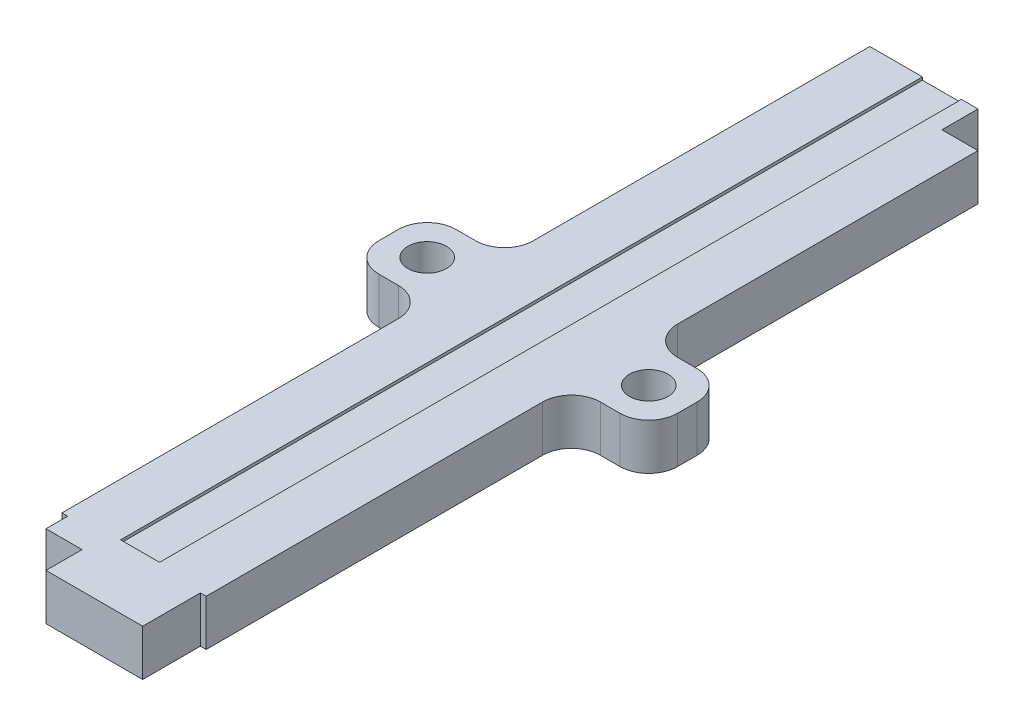
ISO-10303-21;
HEADER;
FILE_DESCRIPTION(('STEP AP214'),'2;1');
FILE_NAME('part.step','',(''),(''),'','','');
FILE_SCHEMA(('AUTOMOTIVE_DESIGN { 1 0 10303 214 1 1 1 1 }'));
ENDSEC;
DATA;
#1=APPLICATION_CONTEXT('core data for automotive mechanical design processes');
#2=APPLICATION_PROTOCOL_DEFINITION('international standard','automotive_design',2000,#1);
#3=PRODUCT_CONTEXT('',#1,'mechanical');
#4=PRODUCT('Part','Part','',(#3));
#5=PRODUCT_RELATED_PRODUCT_CATEGORY('part','',(#4));
#6=PRODUCT_DEFINITION_FORMATION('','',#4);
#7=PRODUCT_DEFINITION_CONTEXT('part definition',#1,'design');
#8=PRODUCT_DEFINITION('design','',#6,#7);
#9=PRODUCT_DEFINITION_SHAPE('','',#8);
#10=(LENGTH_UNIT() NAMED_UNIT(*) SI_UNIT(.MILLI.,.METRE.));
#11=(NAMED_UNIT(*) PLANE_ANGLE_UNIT() SI_UNIT($,.RADIAN.));
#12=(NAMED_UNIT(*) SI_UNIT($,.STERADIAN.) SOLID_ANGLE_UNIT());
#13=UNCERTAINTY_MEASURE_WITH_UNIT(LENGTH_MEASURE(1.E-05),#10,'distance_accuracy_value','');
#14=(GEOMETRIC_REPRESENTATION_CONTEXT(3) GLOBAL_UNCERTAINTY_ASSIGNED_CONTEXT((#13)) GLOBAL_UNIT_ASSIGNED_CONTEXT((#10,
#11,#12)) REPRESENTATION_CONTEXT('',''));
#15=CARTESIAN_POINT('',(0.,0.,0.));
#16=DIRECTION('',(0.,0.,1.));
#17=DIRECTION('',(1.,0.,0.));
#18=AXIS2_PLACEMENT_3D('',#15,#16,#17);
#19=CARTESIAN_POINT('',(-6.35,-2.032,228.6));
#20=DIRECTION('',(1.,0.,0.));
#21=DIRECTION('',(0.,0.,-1.));
#22=AXIS2_PLACEMENT_3D('',#19,#20,#21);
#23=PLANE('',#22);
#24=DIRECTION('',(0.,0.,-1.));
#25=VECTOR('',#24,1.);
#26=CARTESIAN_POINT('',(-6.35,2.032,228.6));
#27=LINE('',#26,#25);
#28=CARTESIAN_POINT('',(-6.34999999999999,2.032,223.52));
#29=VERTEX_POINT('',#28);
#30=CARTESIAN_POINT('',(-6.35,2.032,193.90106));
#31=VERTEX_POINT('',#30);
#32=EDGE_CURVE('E389',#29,#31,#27,.T.);
#33=ORIENTED_EDGE('',*,*,#32,.T.);
#34=DIRECTION('',(0.,1.,0.));
#35=VECTOR('',#34,1.);
#36=CARTESIAN_POINT('',(-6.35,-2.032,193.90106));
#37=LINE('',#36,#35);
#38=CARTESIAN_POINT('',(-6.35,-2.032,193.90106));
#39=VERTEX_POINT('',#38);
#40=EDGE_CURVE('E446',#31,#39,#37,.F.);
#41=ORIENTED_EDGE('',*,*,#40,.T.);
#42=DIRECTION('',(0.,0.,-1.));
#43=VECTOR('',#42,1.);
#44=CARTESIAN_POINT('',(-6.35,-2.032,228.6));
#45=LINE('',#44,#43);
#46=CARTESIAN_POINT('',(-6.34999999999999,-2.032,223.52));
#47=VERTEX_POINT('',#46);
#48=EDGE_CURVE('E254',#47,#39,#45,.T.);
#49=ORIENTED_EDGE('',*,*,#48,.F.);
#50=DIRECTION('',(0.,1.,0.));
#51=VECTOR('',#50,1.);
#52=CARTESIAN_POINT('',(-6.34999999999999,-2.032,223.52));
#53=LINE('',#52,#51);
#54=EDGE_CURVE('E331',#47,#29,#53,.T.);
#55=ORIENTED_EDGE('',*,*,#54,.T.);
#56=EDGE_LOOP('',(#33,#41,#49,#55));
#57=FACE_BOUND('',#56,.T.);
#58=ADVANCED_FACE('F35',(#57),#23,.F.);
#59=CARTESIAN_POINT('',(6.35,-2.032,228.6));
#60=DIRECTION('',(-1.,0.,0.));
#61=DIRECTION('',(0.,0.,1.));
#62=AXIS2_PLACEMENT_3D('',#59,#60,#61);
#63=PLANE('',#62);
#64=DIRECTION('',(0.,0.,-1.));
#65=VECTOR('',#64,1.);
#66=CARTESIAN_POINT('',(6.35,2.032,228.6));
#67=LINE('',#66,#65);
#68=CARTESIAN_POINT('',(6.35,2.032,182.01894));
#69=VERTEX_POINT('',#68);
#70=CARTESIAN_POINT('',(6.34999999999999,2.032,155.575));
#71=VERTEX_POINT('',#70);
#72=EDGE_CURVE('E380',#69,#71,#67,.T.);
#73=ORIENTED_EDGE('',*,*,#72,.F.);
#74=DIRECTION('',(0.,1.,0.));
#75=VECTOR('',#74,1.);
#76=CARTESIAN_POINT('',(6.35,-2.032,182.01894));
#77=LINE('',#76,#75);
#78=CARTESIAN_POINT('',(6.35,-2.032,182.01894));
#79=VERTEX_POINT('',#78);
#80=EDGE_CURVE('E428',#69,#79,#77,.F.);
#81=ORIENTED_EDGE('',*,*,#80,.T.);
#82=DIRECTION('',(0.,0.,-1.));
#83=VECTOR('',#82,1.);
#84=CARTESIAN_POINT('',(6.35,-2.032,228.6));
#85=LINE('',#84,#83);
#86=CARTESIAN_POINT('',(6.34999999999999,-2.032,155.575));
#87=VERTEX_POINT('',#86);
#88=EDGE_CURVE('E362',#79,#87,#85,.T.);
#89=ORIENTED_EDGE('',*,*,#88,.T.);
#90=DIRECTION('',(0.,1.,0.));
#91=VECTOR('',#90,1.);
#92=CARTESIAN_POINT('',(6.34999999999999,-2.032,155.575));
#93=LINE('',#92,#91);
#94=EDGE_CURVE('E283',#87,#71,#93,.T.);
#95=ORIENTED_EDGE('',*,*,#94,.T.);
#96=EDGE_LOOP('',(#73,#81,#89,#95));
#97=FACE_BOUND('',#96,.T.);
#98=ADVANCED_FACE('F531',(#97),#63,.F.);
#99=CARTESIAN_POINT('',(-6.35,2.032,228.6));
#100=DIRECTION('',(0.,-1.,0.));
#101=DIRECTION('',(0.,0.,-1.));
#102=AXIS2_PLACEMENT_3D('',#99,#100,#101);
#103=PLANE('',#102);
#104=DIRECTION('',(-1.,0.,0.));
#105=VECTOR('',#104,1.);
#106=CARTESIAN_POINT('',(0.,2.032,191.36106));
#107=LINE('',#106,#105);
#108=CARTESIAN_POINT('',(10.61212,2.032,191.36106));
#109=VERTEX_POINT('',#108);
#110=CARTESIAN_POINT('',(8.89,2.032,191.36106));
#111=VERTEX_POINT('',#110);
#112=EDGE_CURVE('E507',#109,#111,#107,.T.);
#113=ORIENTED_EDGE('',*,*,#112,.F.);
#114=CARTESIAN_POINT('',(10.61212,2.032,188.82106));
#115=DIRECTION('',(0.,-1.,0.));
#116=DIRECTION('',(0.,0.,-1.));
#117=AXIS2_PLACEMENT_3D('',#114,#115,#116);
#118=CIRCLE('',#117,2.54);
#119=CARTESIAN_POINT('',(13.15212,2.032,188.82106));
#120=VERTEX_POINT('',#119);
#121=EDGE_CURVE('E567',#109,#120,#118,.F.);
#122=ORIENTED_EDGE('',*,*,#121,.T.);
#123=DIRECTION('',(0.,0.,1.));
#124=VECTOR('',#123,1.);
#125=CARTESIAN_POINT('',(13.15212,2.032,0.));
#126=LINE('',#125,#124);
#127=CARTESIAN_POINT('',(13.15212,2.032,187.09894));
#128=VERTEX_POINT('',#127);
#129=EDGE_CURVE('E411',#128,#120,#126,.T.);
#130=ORIENTED_EDGE('',*,*,#129,.F.);
#131=CARTESIAN_POINT('',(10.61212,2.032,187.09894));
#132=DIRECTION('',(0.,-1.,0.));
#133=DIRECTION('',(0.,0.,-1.));
#134=AXIS2_PLACEMENT_3D('',#131,#132,#133);
#135=CIRCLE('',#134,2.54);
#136=CARTESIAN_POINT('',(10.61212,2.032,184.55894));
#137=VERTEX_POINT('',#136);
#138=EDGE_CURVE('E563',#128,#137,#135,.F.);
#139=ORIENTED_EDGE('',*,*,#138,.T.);
#140=DIRECTION('',(-1.,0.,0.));
#141=VECTOR('',#140,1.);
#142=CARTESIAN_POINT('',(7.53079865499333E-13,2.032,184.55894));
#143=LINE('',#142,#141);
#144=CARTESIAN_POINT('',(8.89000000000001,2.032,184.55894));
#145=VERTEX_POINT('',#144);
#146=EDGE_CURVE('E390',#137,#145,#143,.T.);
#147=ORIENTED_EDGE('',*,*,#146,.T.);
#148=CARTESIAN_POINT('',(8.89,2.032,182.01894));
#149=DIRECTION('',(0.,-1.,0.));
#150=DIRECTION('',(0.,0.,-1.));
#151=AXIS2_PLACEMENT_3D('',#148,#149,#150);
#152=CIRCLE('',#151,2.54);
#153=EDGE_CURVE('E452',#145,#69,#152,.T.);
#154=ORIENTED_EDGE('',*,*,#153,.T.);
#155=ORIENTED_EDGE('',*,*,#72,.T.);
#156=DIRECTION('',(1.,0.,0.));
#157=VECTOR('',#156,1.);
#158=CARTESIAN_POINT('',(3.17499999999999,2.032,155.575));
#159=LINE('',#158,#157);
#160=CARTESIAN_POINT('',(3.17499999999999,2.032,155.575));
#161=VERTEX_POINT('',#160);
#162=EDGE_CURVE('E266',#161,#71,#159,.T.);
#163=ORIENTED_EDGE('',*,*,#162,.F.);
#164=DIRECTION('',(0.,0.,1.));
#165=VECTOR('',#164,1.);
#166=CARTESIAN_POINT('',(3.17499999999999,2.032,152.4));
#167=LINE('',#166,#165);
#168=CARTESIAN_POINT('',(3.17499999999999,2.032,152.4));
#169=VERTEX_POINT('',#168);
#170=EDGE_CURVE('E512',#169,#161,#167,.T.);
#171=ORIENTED_EDGE('',*,*,#170,.F.);
#172=DIRECTION('',(1.,0.,0.));
#173=VECTOR('',#172,1.);
#174=CARTESIAN_POINT('',(-6.34999999999997,2.032,152.4));
#175=LINE('',#174,#173);
#176=CARTESIAN_POINT('',(1.7145,2.032,152.4));
#177=VERTEX_POINT('',#176);
#178=EDGE_CURVE('E502',#177,#169,#175,.T.);
#179=ORIENTED_EDGE('',*,*,#178,.F.);
#180=DIRECTION('',(0.,0.,-1.));
#181=VECTOR('',#180,1.);
#182=CARTESIAN_POINT('',(1.7145,2.032,5.61339999999999));
#183=LINE('',#182,#181);
#184=CARTESIAN_POINT('',(1.7145,2.032,222.9866));
#185=VERTEX_POINT('',#184);
#186=EDGE_CURVE('E340',#185,#177,#183,.T.);
#187=ORIENTED_EDGE('',*,*,#186,.F.);
#188=DIRECTION('',(1.,0.,0.));
#189=VECTOR('',#188,1.);
#190=CARTESIAN_POINT('',(-1.7145,2.032,222.9866));
#191=LINE('',#190,#189);
#192=CARTESIAN_POINT('',(-1.7145,2.032,222.9866));
#193=VERTEX_POINT('',#192);
#194=EDGE_CURVE('E348',#193,#185,#191,.T.);
#195=ORIENTED_EDGE('',*,*,#194,.F.);
#196=DIRECTION('',(0.,0.,1.));
#197=VECTOR('',#196,1.);
#198=CARTESIAN_POINT('',(-1.7145,2.032,5.6134));
#199=LINE('',#198,#197);
#200=CARTESIAN_POINT('',(-1.7145,2.032,152.4));
#201=VERTEX_POINT('',#200);
#202=EDGE_CURVE('E334',#201,#193,#199,.T.);
#203=ORIENTED_EDGE('',*,*,#202,.F.);
#204=CARTESIAN_POINT('',(-6.34999999999997,2.032,152.4));
#205=VERTEX_POINT('',#204);
#206=EDGE_CURVE('E510',#205,#201,#175,.T.);
#207=ORIENTED_EDGE('',*,*,#206,.F.);
#208=CARTESIAN_POINT('',(-6.35,2.032,182.01894));
#209=VERTEX_POINT('',#208);
#210=EDGE_CURVE('E270',#209,#205,#27,.T.);
#211=ORIENTED_EDGE('',*,*,#210,.F.);
#212=CARTESIAN_POINT('',(-8.89,2.032,182.01894));
#213=DIRECTION('',(0.,-1.,0.));
#214=DIRECTION('',(0.,0.,-1.));
#215=AXIS2_PLACEMENT_3D('',#212,#213,#214);
#216=CIRCLE('',#215,2.54);
#217=CARTESIAN_POINT('',(-8.89000000000001,2.032,184.55894));
#218=VERTEX_POINT('',#217);
#219=EDGE_CURVE('E456',#209,#218,#216,.T.);
#220=ORIENTED_EDGE('',*,*,#219,.T.);
#221=DIRECTION('',(1.,0.,0.));
#222=VECTOR('',#221,1.);
#223=CARTESIAN_POINT('',(-7.53079865499333E-13,2.032,184.55894));
#224=LINE('',#223,#222);
#225=CARTESIAN_POINT('',(-10.61212,2.032,184.55894));
#226=VERTEX_POINT('',#225);
#227=EDGE_CURVE('E394',#226,#218,#224,.T.);
#228=ORIENTED_EDGE('',*,*,#227,.F.);
#229=CARTESIAN_POINT('',(-10.61212,2.032,187.09894));
#230=DIRECTION('',(0.,-1.,0.));
#231=DIRECTION('',(0.,0.,-1.));
#232=AXIS2_PLACEMENT_3D('',#229,#230,#231);
#233=CIRCLE('',#232,2.54);
#234=CARTESIAN_POINT('',(-13.15212,2.032,187.09894));
#235=VERTEX_POINT('',#234);
#236=EDGE_CURVE('E562',#226,#235,#233,.F.);
#237=ORIENTED_EDGE('',*,*,#236,.T.);
#238=DIRECTION('',(0.,0.,1.));
#239=VECTOR('',#238,1.);
#240=CARTESIAN_POINT('',(-13.15212,2.032,0.));
#241=LINE('',#240,#239);
#242=CARTESIAN_POINT('',(-13.15212,2.032,188.82106));
#243=VERTEX_POINT('',#242);
#244=EDGE_CURVE('E492',#235,#243,#241,.T.);
#245=ORIENTED_EDGE('',*,*,#244,.T.);
#246=CARTESIAN_POINT('',(-10.61212,2.032,188.82106));
#247=DIRECTION('',(0.,-1.,0.));
#248=DIRECTION('',(0.,0.,-1.));
#249=AXIS2_PLACEMENT_3D('',#246,#247,#248);
#250=CIRCLE('',#249,2.54);
#251=CARTESIAN_POINT('',(-10.61212,2.032,191.36106));
#252=VERTEX_POINT('',#251);
#253=EDGE_CURVE('E557',#243,#252,#250,.F.);
#254=ORIENTED_EDGE('',*,*,#253,.T.);
#255=DIRECTION('',(1.,0.,0.));
#256=VECTOR('',#255,1.);
#257=CARTESIAN_POINT('',(0.,2.032,191.36106));
#258=LINE('',#257,#256);
#259=CARTESIAN_POINT('',(-8.89,2.032,191.36106));
#260=VERTEX_POINT('',#259);
#261=EDGE_CURVE('E398',#252,#260,#258,.T.);
#262=ORIENTED_EDGE('',*,*,#261,.T.);
#263=CARTESIAN_POINT('',(-8.89,2.032,193.90106));
#264=DIRECTION('',(0.,-1.,0.));
#265=DIRECTION('',(0.,0.,-1.));
#266=AXIS2_PLACEMENT_3D('',#263,#264,#265);
#267=CIRCLE('',#266,2.54);
#268=EDGE_CURVE('E43',#260,#31,#267,.T.);
#269=ORIENTED_EDGE('',*,*,#268,.T.);
#270=ORIENTED_EDGE('',*,*,#32,.F.);
#271=DIRECTION('',(-1.,0.,0.));
#272=VECTOR('',#271,1.);
#273=CARTESIAN_POINT('',(-6.34999999999999,2.032,223.52));
#274=LINE('',#273,#272);
#275=CARTESIAN_POINT('',(-5.84199999999999,2.032,223.52));
#276=VERTEX_POINT('',#275);
#277=EDGE_CURVE('E325',#276,#29,#274,.T.);
#278=ORIENTED_EDGE('',*,*,#277,.F.);
#279=DIRECTION('',(0.,0.,-1.));
#280=VECTOR('',#279,1.);
#281=CARTESIAN_POINT('',(-5.84199999999999,2.032,228.6));
#282=LINE('',#281,#280);
#283=CARTESIAN_POINT('',(-5.84199999999999,2.032,225.425));
#284=VERTEX_POINT('',#283);
#285=EDGE_CURVE('E318',#284,#276,#282,.T.);
#286=ORIENTED_EDGE('',*,*,#285,.F.);
#287=DIRECTION('',(-1.,0.,0.));
#288=VECTOR('',#287,1.);
#289=CARTESIAN_POINT('',(-5.84199999999999,2.032,225.425));
#290=LINE('',#289,#288);
#291=CARTESIAN_POINT('',(-2.66699999999999,2.032,225.425));
#292=VERTEX_POINT('',#291);
#293=EDGE_CURVE('E291',#292,#284,#290,.T.);
#294=ORIENTED_EDGE('',*,*,#293,.F.);
#295=DIRECTION('',(0.,0.,-1.));
#296=VECTOR('',#295,1.);
#297=CARTESIAN_POINT('',(-2.66699999999999,2.032,228.6));
#298=LINE('',#297,#296);
#299=CARTESIAN_POINT('',(-2.66699999999999,2.032,228.6));
#300=VERTEX_POINT('',#299);
#301=EDGE_CURVE('E286',#300,#292,#298,.T.);
#302=ORIENTED_EDGE('',*,*,#301,.F.);
#303=DIRECTION('',(-1.,0.,0.));
#304=VECTOR('',#303,1.);
#305=CARTESIAN_POINT('',(-6.35,2.032,228.6));
#306=LINE('',#305,#304);
#307=CARTESIAN_POINT('',(5.84199999999999,2.032,228.6));
#308=VERTEX_POINT('',#307);
#309=EDGE_CURVE('E355',#308,#300,#306,.T.);
#310=ORIENTED_EDGE('',*,*,#309,.F.);
#311=DIRECTION('',(0.,0.,-1.));
#312=VECTOR('',#311,1.);
#313=CARTESIAN_POINT('',(5.84199999999999,2.032,228.6));
#314=LINE('',#313,#312);
#315=CARTESIAN_POINT('',(5.84199999999999,2.032,223.52));
#316=VERTEX_POINT('',#315);
#317=EDGE_CURVE('E308',#308,#316,#314,.T.);
#318=ORIENTED_EDGE('',*,*,#317,.T.);
#319=DIRECTION('',(1.,0.,0.));
#320=VECTOR('',#319,1.);
#321=CARTESIAN_POINT('',(6.34999999999999,2.032,223.52));
#322=LINE('',#321,#320);
#323=CARTESIAN_POINT('',(6.34999999999999,2.032,223.52));
#324=VERTEX_POINT('',#323);
#325=EDGE_CURVE('E301',#316,#324,#322,.T.);
#326=ORIENTED_EDGE('',*,*,#325,.T.);
#327=CARTESIAN_POINT('',(6.35,2.032,193.90106));
#328=VERTEX_POINT('',#327);
#329=EDGE_CURVE('E377',#324,#328,#67,.T.);
#330=ORIENTED_EDGE('',*,*,#329,.T.);
#331=CARTESIAN_POINT('',(8.89,2.032,193.90106));
#332=DIRECTION('',(0.,-1.,0.));
#333=DIRECTION('',(0.,0.,-1.));
#334=AXIS2_PLACEMENT_3D('',#331,#332,#333);
#335=CIRCLE('',#334,2.54);
#336=EDGE_CURVE('E448',#328,#111,#335,.T.);
#337=ORIENTED_EDGE('',*,*,#336,.T.);
#338=EDGE_LOOP('',(#113,#122,#130,#139,#147,#154,#155,#163,#171,#179,#187,#195,#203,#207,#211,
#220,#228,#237,#245,#254,#262,#269,#270,#278,#286,#294,#302,#310,#318,#326,#330,#337));
#339=FACE_BOUND('',#338,.T.);
#340=CARTESIAN_POINT('',(9.75106000000001,2.032,187.96));
#341=DIRECTION('',(0.,1.,0.));
#342=DIRECTION('',(0.,0.,1.));
#343=AXIS2_PLACEMENT_3D('',#340,#341,#342);
#344=CIRCLE('',#343,1.70053000000001);
#345=CARTESIAN_POINT('',(9.75106000000001,2.032,189.66053));
#346=VERTEX_POINT('',#345);
#347=EDGE_CURVE('E498',#346,#346,#344,.F.);
#348=ORIENTED_EDGE('',*,*,#347,.T.);
#349=EDGE_LOOP('',(#348));
#350=FACE_BOUND('',#349,.T.);
#351=CARTESIAN_POINT('',(-9.75106000000001,2.032,187.96));
#352=DIRECTION('',(0.,1.,0.));
#353=DIRECTION('',(0.,0.,1.));
#354=AXIS2_PLACEMENT_3D('',#351,#352,#353);
#355=CIRCLE('',#354,1.70053000000001);
#356=CARTESIAN_POINT('',(-9.75106000000001,2.032,189.66053));
#357=VERTEX_POINT('',#356);
#358=EDGE_CURVE('E489',#357,#357,#355,.T.);
#359=ORIENTED_EDGE('',*,*,#358,.F.);
#360=EDGE_LOOP('',(#359));
#361=FACE_BOUND('',#360,.T.);
#362=ADVANCED_FACE('F463',(#339,#350,#361),#103,.F.);
#363=CARTESIAN_POINT('',(-6.35,-2.032,228.6));
#364=DIRECTION('',(0.,1.,0.));
#365=DIRECTION('',(0.,0.,1.));
#366=AXIS2_PLACEMENT_3D('',#363,#364,#365);
#367=PLANE('',#366);
#368=DIRECTION('',(0.,0.,1.));
#369=VECTOR('',#368,1.);
#370=CARTESIAN_POINT('',(13.15212,-2.032,0.));
#371=LINE('',#370,#369);
#372=CARTESIAN_POINT('',(13.15212,-2.032,187.09894));
#373=VERTEX_POINT('',#372);
#374=CARTESIAN_POINT('',(13.15212,-2.032,188.82106));
#375=VERTEX_POINT('',#374);
#376=EDGE_CURVE('E495',#373,#375,#371,.T.);
#377=ORIENTED_EDGE('',*,*,#376,.T.);
#378=CARTESIAN_POINT('',(10.61212,-2.032,188.82106));
#379=DIRECTION('',(0.,1.,0.));
#380=DIRECTION('',(0.,0.,1.));
#381=AXIS2_PLACEMENT_3D('',#378,#379,#380);
#382=CIRCLE('',#381,2.54);
#383=CARTESIAN_POINT('',(10.61212,-2.032,191.36106));
#384=VERTEX_POINT('',#383);
#385=EDGE_CURVE('E421',#375,#384,#382,.F.);
#386=ORIENTED_EDGE('',*,*,#385,.T.);
#387=DIRECTION('',(-1.,0.,0.));
#388=VECTOR('',#387,1.);
#389=CARTESIAN_POINT('',(0.,-2.032,191.36106));
#390=LINE('',#389,#388);
#391=CARTESIAN_POINT('',(8.89,-2.032,191.36106));
#392=VERTEX_POINT('',#391);
#393=EDGE_CURVE('E503',#384,#392,#390,.T.);
#394=ORIENTED_EDGE('',*,*,#393,.T.);
#395=CARTESIAN_POINT('',(8.89,-2.032,193.90106));
#396=DIRECTION('',(0.,1.,0.));
#397=DIRECTION('',(0.,0.,1.));
#398=AXIS2_PLACEMENT_3D('',#395,#396,#397);
#399=CIRCLE('',#398,2.54);
#400=CARTESIAN_POINT('',(6.35,-2.032,193.90106));
#401=VERTEX_POINT('',#400);
#402=EDGE_CURVE('E450',#392,#401,#399,.T.);
#403=ORIENTED_EDGE('',*,*,#402,.T.);
#404=CARTESIAN_POINT('',(6.34999999999999,-2.032,223.52));
#405=VERTEX_POINT('',#404);
#406=EDGE_CURVE('E255',#405,#401,#85,.T.);
#407=ORIENTED_EDGE('',*,*,#406,.F.);
#408=DIRECTION('',(1.,0.,0.));
#409=VECTOR('',#408,1.);
#410=CARTESIAN_POINT('',(6.34999999999999,-2.032,223.52));
#411=LINE('',#410,#409);
#412=CARTESIAN_POINT('',(5.84199999999999,-2.032,223.52));
#413=VERTEX_POINT('',#412);
#414=EDGE_CURVE('E305',#413,#405,#411,.T.);
#415=ORIENTED_EDGE('',*,*,#414,.F.);
#416=DIRECTION('',(0.,0.,-1.));
#417=VECTOR('',#416,1.);
#418=CARTESIAN_POINT('',(5.84199999999999,-2.032,228.6));
#419=LINE('',#418,#417);
#420=CARTESIAN_POINT('',(5.84199999999999,-2.032,228.6));
#421=VERTEX_POINT('',#420);
#422=EDGE_CURVE('E307',#421,#413,#419,.T.);
#423=ORIENTED_EDGE('',*,*,#422,.F.);
#424=DIRECTION('',(1.,0.,0.));
#425=VECTOR('',#424,1.);
#426=CARTESIAN_POINT('',(-6.35,-2.032,228.6));
#427=LINE('',#426,#425);
#428=CARTESIAN_POINT('',(-2.66699999999999,-2.032,228.6));
#429=VERTEX_POINT('',#428);
#430=EDGE_CURVE('E360',#429,#421,#427,.T.);
#431=ORIENTED_EDGE('',*,*,#430,.F.);
#432=DIRECTION('',(0.,0.,-1.));
#433=VECTOR('',#432,1.);
#434=CARTESIAN_POINT('',(-2.66699999999999,-2.032,228.6));
#435=LINE('',#434,#433);
#436=CARTESIAN_POINT('',(-2.66699999999999,-2.032,225.425));
#437=VERTEX_POINT('',#436);
#438=EDGE_CURVE('E287',#429,#437,#435,.T.);
#439=ORIENTED_EDGE('',*,*,#438,.T.);
#440=DIRECTION('',(-1.,0.,0.));
#441=VECTOR('',#440,1.);
#442=CARTESIAN_POINT('',(-5.84199999999999,-2.032,225.425));
#443=LINE('',#442,#441);
#444=CARTESIAN_POINT('',(-5.84199999999999,-2.032,225.425));
#445=VERTEX_POINT('',#444);
#446=EDGE_CURVE('E290',#437,#445,#443,.T.);
#447=ORIENTED_EDGE('',*,*,#446,.T.);
#448=DIRECTION('',(0.,0.,-1.));
#449=VECTOR('',#448,1.);
#450=CARTESIAN_POINT('',(-5.84199999999999,-2.032,228.6));
#451=LINE('',#450,#449);
#452=CARTESIAN_POINT('',(-5.84199999999999,-2.032,223.52));
#453=VERTEX_POINT('',#452);
#454=EDGE_CURVE('E322',#445,#453,#451,.T.);
#455=ORIENTED_EDGE('',*,*,#454,.T.);
#456=DIRECTION('',(-1.,0.,0.));
#457=VECTOR('',#456,1.);
#458=CARTESIAN_POINT('',(-6.34999999999999,-2.032,223.52));
#459=LINE('',#458,#457);
#460=EDGE_CURVE('E324',#453,#47,#459,.T.);
#461=ORIENTED_EDGE('',*,*,#460,.T.);
#462=ORIENTED_EDGE('',*,*,#48,.T.);
#463=CARTESIAN_POINT('',(-8.89,-2.032,193.90106));
#464=DIRECTION('',(0.,1.,0.));
#465=DIRECTION('',(0.,0.,1.));
#466=AXIS2_PLACEMENT_3D('',#463,#464,#465);
#467=CIRCLE('',#466,2.54);
#468=CARTESIAN_POINT('',(-8.89,-2.032,191.36106));
#469=VERTEX_POINT('',#468);
#470=EDGE_CURVE('E11',#39,#469,#467,.T.);
#471=ORIENTED_EDGE('',*,*,#470,.T.);
#472=DIRECTION('',(1.,0.,0.));
#473=VECTOR('',#472,1.);
#474=CARTESIAN_POINT('',(0.,-2.032,191.36106));
#475=LINE('',#474,#473);
#476=CARTESIAN_POINT('',(-10.61212,-2.032,191.36106));
#477=VERTEX_POINT('',#476);
#478=EDGE_CURVE('E412',#477,#469,#475,.T.);
#479=ORIENTED_EDGE('',*,*,#478,.F.);
#480=CARTESIAN_POINT('',(-10.61212,-2.032,188.82106));
#481=DIRECTION('',(0.,1.,0.));
#482=DIRECTION('',(0.,0.,1.));
#483=AXIS2_PLACEMENT_3D('',#480,#481,#482);
#484=CIRCLE('',#483,2.54);
#485=CARTESIAN_POINT('',(-13.15212,-2.032,188.82106));
#486=VERTEX_POINT('',#485);
#487=EDGE_CURVE('E414',#477,#486,#484,.F.);
#488=ORIENTED_EDGE('',*,*,#487,.T.);
#489=DIRECTION('',(0.,0.,1.));
#490=VECTOR('',#489,1.);
#491=CARTESIAN_POINT('',(-13.15212,-2.032,0.));
#492=LINE('',#491,#490);
#493=CARTESIAN_POINT('',(-13.15212,-2.032,187.09894));
#494=VERTEX_POINT('',#493);
#495=EDGE_CURVE('E480',#494,#486,#492,.T.);
#496=ORIENTED_EDGE('',*,*,#495,.F.);
#497=CARTESIAN_POINT('',(-10.61212,-2.032,187.09894));
#498=DIRECTION('',(0.,1.,0.));
#499=DIRECTION('',(0.,0.,1.));
#500=AXIS2_PLACEMENT_3D('',#497,#498,#499);
#501=CIRCLE('',#500,2.54);
#502=CARTESIAN_POINT('',(-10.61212,-2.032,184.55894));
#503=VERTEX_POINT('',#502);
#504=EDGE_CURVE('E416',#494,#503,#501,.F.);
#505=ORIENTED_EDGE('',*,*,#504,.T.);
#506=DIRECTION('',(1.,0.,0.));
#507=VECTOR('',#506,1.);
#508=CARTESIAN_POINT('',(-7.53079865499333E-13,-2.032,184.55894));
#509=LINE('',#508,#507);
#510=CARTESIAN_POINT('',(-8.89000000000001,-2.032,184.55894));
#511=VERTEX_POINT('',#510);
#512=EDGE_CURVE('E409',#503,#511,#509,.T.);
#513=ORIENTED_EDGE('',*,*,#512,.T.);
#514=CARTESIAN_POINT('',(-8.89,-2.032,182.01894));
#515=DIRECTION('',(0.,1.,0.));
#516=DIRECTION('',(0.,0.,1.));
#517=AXIS2_PLACEMENT_3D('',#514,#515,#516);
#518=CIRCLE('',#517,2.54);
#519=CARTESIAN_POINT('',(-6.35,-2.032,182.01894));
#520=VERTEX_POINT('',#519);
#521=EDGE_CURVE('E50',#511,#520,#518,.T.);
#522=ORIENTED_EDGE('',*,*,#521,.T.);
#523=CARTESIAN_POINT('',(-6.34999999999997,-2.032,152.4));
#524=VERTEX_POINT('',#523);
#525=EDGE_CURVE('E243',#520,#524,#45,.T.);
#526=ORIENTED_EDGE('',*,*,#525,.T.);
#527=DIRECTION('',(1.,0.,0.));
#528=VECTOR('',#527,1.);
#529=CARTESIAN_POINT('',(-6.34999999999997,-2.032,152.4));
#530=LINE('',#529,#528);
#531=CARTESIAN_POINT('',(3.17499999999999,-2.032,152.4));
#532=VERTEX_POINT('',#531);
#533=EDGE_CURVE('E249',#524,#532,#530,.T.);
#534=ORIENTED_EDGE('',*,*,#533,.T.);
#535=DIRECTION('',(0.,0.,1.));
#536=VECTOR('',#535,1.);
#537=CARTESIAN_POINT('',(3.17499999999999,-2.032,152.4));
#538=LINE('',#537,#536);
#539=CARTESIAN_POINT('',(3.17499999999999,-2.032,155.575));
#540=VERTEX_POINT('',#539);
#541=EDGE_CURVE('E265',#532,#540,#538,.T.);
#542=ORIENTED_EDGE('',*,*,#541,.T.);
#543=DIRECTION('',(1.,0.,0.));
#544=VECTOR('',#543,1.);
#545=CARTESIAN_POINT('',(3.17499999999999,-2.032,155.575));
#546=LINE('',#545,#544);
#547=EDGE_CURVE('E271',#540,#87,#546,.T.);
#548=ORIENTED_EDGE('',*,*,#547,.T.);
#549=ORIENTED_EDGE('',*,*,#88,.F.);
#550=CARTESIAN_POINT('',(8.89,-2.032,182.01894));
#551=DIRECTION('',(0.,1.,0.));
#552=DIRECTION('',(0.,0.,1.));
#553=AXIS2_PLACEMENT_3D('',#550,#551,#552);
#554=CIRCLE('',#553,2.54);
#555=CARTESIAN_POINT('',(8.89000000000001,-2.032,184.55894));
#556=VERTEX_POINT('',#555);
#557=EDGE_CURVE('E454',#79,#556,#554,.T.);
#558=ORIENTED_EDGE('',*,*,#557,.T.);
#559=DIRECTION('',(-1.,0.,0.));
#560=VECTOR('',#559,1.);
#561=CARTESIAN_POINT('',(7.53079865499333E-13,-2.032,184.55894));
#562=LINE('',#561,#560);
#563=CARTESIAN_POINT('',(10.61212,-2.032,184.55894));
#564=VERTEX_POINT('',#563);
#565=EDGE_CURVE('E497',#564,#556,#562,.T.);
#566=ORIENTED_EDGE('',*,*,#565,.F.);
#567=CARTESIAN_POINT('',(10.61212,-2.032,187.09894));
#568=DIRECTION('',(0.,1.,0.));
#569=DIRECTION('',(0.,0.,1.));
#570=AXIS2_PLACEMENT_3D('',#567,#568,#569);
#571=CIRCLE('',#570,2.54);
#572=EDGE_CURVE('E419',#564,#373,#571,.F.);
#573=ORIENTED_EDGE('',*,*,#572,.T.);
#574=EDGE_LOOP('',(#377,#386,#394,#403,#407,#415,#423,#431,#439,#447,#455,#461,#462,#471,#479,
#488,#496,#505,#513,#522,#526,#534,#542,#548,#549,#558,#566,#573));
#575=FACE_BOUND('',#574,.T.);
#576=CARTESIAN_POINT('',(9.75106000000001,-2.032,187.96));
#577=DIRECTION('',(0.,1.,0.));
#578=DIRECTION('',(0.,0.,1.));
#579=AXIS2_PLACEMENT_3D('',#576,#577,#578);
#580=CIRCLE('',#579,1.70053000000001);
#581=CARTESIAN_POINT('',(9.75106000000001,-2.032,189.66053));
#582=VERTEX_POINT('',#581);
#583=EDGE_CURVE('E499',#582,#582,#580,.F.);
#584=ORIENTED_EDGE('',*,*,#583,.F.);
#585=EDGE_LOOP('',(#584));
#586=FACE_BOUND('',#585,.T.);
#587=CARTESIAN_POINT('',(-9.75106000000001,-2.032,187.96));
#588=DIRECTION('',(0.,1.,0.));
#589=DIRECTION('',(0.,0.,1.));
#590=AXIS2_PLACEMENT_3D('',#587,#588,#589);
#591=CIRCLE('',#590,1.70053000000001);
#592=CARTESIAN_POINT('',(-9.75106000000001,-2.032,189.66053));
#593=VERTEX_POINT('',#592);
#594=EDGE_CURVE('E397',#593,#593,#591,.T.);
#595=ORIENTED_EDGE('',*,*,#594,.T.);
#596=EDGE_LOOP('',(#595));
#597=FACE_BOUND('',#596,.T.);
#598=ADVANCED_FACE('F246',(#575,#586,#597),#367,.F.);
#599=ORIENTED_EDGE('',*,*,#406,.T.);
#600=DIRECTION('',(0.,1.,0.));
#601=VECTOR('',#600,1.);
#602=CARTESIAN_POINT('',(6.35,2.032,193.90106));
#603=LINE('',#602,#601);
#604=EDGE_CURVE('E556',#401,#328,#603,.T.);
#605=ORIENTED_EDGE('',*,*,#604,.T.);
#606=ORIENTED_EDGE('',*,*,#329,.F.);
#607=DIRECTION('',(0.,1.,0.));
#608=VECTOR('',#607,1.);
#609=CARTESIAN_POINT('',(6.34999999999999,-2.032,223.52));
#610=LINE('',#609,#608);
#611=EDGE_CURVE('E310',#405,#324,#610,.T.);
#612=ORIENTED_EDGE('',*,*,#611,.F.);
#613=EDGE_LOOP('',(#599,#605,#606,#612));
#614=FACE_BOUND('',#613,.T.);
#615=ADVANCED_FACE('F601',(#614),#63,.F.);
#616=CARTESIAN_POINT('',(0.,0.,228.6));
#617=DIRECTION('',(0.,0.,-1.));
#618=DIRECTION('',(-1.,0.,0.));
#619=AXIS2_PLACEMENT_3D('',#616,#617,#618);
#620=PLANE('',#619);
#621=ORIENTED_EDGE('',*,*,#309,.T.);
#622=DIRECTION('',(0.,1.,0.));
#623=VECTOR('',#622,1.);
#624=CARTESIAN_POINT('',(-2.66699999999999,-2.032,228.6));
#625=LINE('',#624,#623);
#626=EDGE_CURVE('E294',#429,#300,#625,.T.);
#627=ORIENTED_EDGE('',*,*,#626,.F.);
#628=ORIENTED_EDGE('',*,*,#430,.T.);
#629=DIRECTION('',(0.,1.,0.));
#630=VECTOR('',#629,1.);
#631=CARTESIAN_POINT('',(5.84199999999999,-2.032,228.6));
#632=LINE('',#631,#630);
#633=EDGE_CURVE('E315',#421,#308,#632,.T.);
#634=ORIENTED_EDGE('',*,*,#633,.T.);
#635=EDGE_LOOP('',(#621,#627,#628,#634));
#636=FACE_BOUND('',#635,.T.);
#637=ADVANCED_FACE('F606',(#636),#620,.F.);
#638=ORIENTED_EDGE('',*,*,#525,.F.);
#639=DIRECTION('',(0.,1.,0.));
#640=VECTOR('',#639,1.);
#641=CARTESIAN_POINT('',(-6.35,2.032,182.01894));
#642=LINE('',#641,#640);
#643=EDGE_CURVE('E439',#520,#209,#642,.T.);
#644=ORIENTED_EDGE('',*,*,#643,.T.);
#645=ORIENTED_EDGE('',*,*,#210,.T.);
#646=DIRECTION('',(0.,1.,0.));
#647=VECTOR('',#646,1.);
#648=CARTESIAN_POINT('',(-6.34999999999997,-2.032,152.4));
#649=LINE('',#648,#647);
#650=EDGE_CURVE('E260',#524,#205,#649,.T.);
#651=ORIENTED_EDGE('',*,*,#650,.F.);
#652=EDGE_LOOP('',(#638,#644,#645,#651));
#653=FACE_BOUND('',#652,.T.);
#654=ADVANCED_FACE('F268',(#653),#23,.F.);
#655=CARTESIAN_POINT('',(-1.7145,1.778,5.6134));
#656=DIRECTION('',(-1.,0.,0.));
#657=DIRECTION('',(0.,0.,1.));
#658=AXIS2_PLACEMENT_3D('',#655,#656,#657);
#659=PLANE('',#658);
#660=DIRECTION('',(0.,0.,1.));
#661=VECTOR('',#660,1.);
#662=CARTESIAN_POINT('',(-1.7145,1.778,5.6134));
#663=LINE('',#662,#661);
#664=CARTESIAN_POINT('',(-1.7145,1.778,152.4));
#665=VERTEX_POINT('',#664);
#666=CARTESIAN_POINT('',(-1.7145,1.778,222.9866));
#667=VERTEX_POINT('',#666);
#668=EDGE_CURVE('E337',#665,#667,#663,.T.);
#669=ORIENTED_EDGE('',*,*,#668,.F.);
#670=DIRECTION('',(0.,1.,0.));
#671=VECTOR('',#670,1.);
#672=CARTESIAN_POINT('',(-1.7145,1.778,152.4));
#673=LINE('',#672,#671);
#674=EDGE_CURVE('E282',#665,#201,#673,.T.);
#675=ORIENTED_EDGE('',*,*,#674,.T.);
#676=ORIENTED_EDGE('',*,*,#202,.T.);
#677=DIRECTION('',(0.,1.,0.));
#678=VECTOR('',#677,1.);
#679=CARTESIAN_POINT('',(-1.7145,1.778,222.9866));
#680=LINE('',#679,#678);
#681=EDGE_CURVE('E346',#667,#193,#680,.T.);
#682=ORIENTED_EDGE('',*,*,#681,.F.);
#683=EDGE_LOOP('',(#669,#675,#676,#682));
#684=FACE_BOUND('',#683,.T.);
#685=ADVANCED_FACE('F605',(#684),#659,.F.);
#686=CARTESIAN_POINT('',(1.7145,1.778,5.61339999999999));
#687=DIRECTION('',(1.,0.,0.));
#688=DIRECTION('',(0.,0.,-1.));
#689=AXIS2_PLACEMENT_3D('',#686,#687,#688);
#690=PLANE('',#689);
#691=ORIENTED_EDGE('',*,*,#186,.T.);
#692=DIRECTION('',(0.,-1.,0.));
#693=VECTOR('',#692,1.);
#694=CARTESIAN_POINT('',(1.7145,1.778,152.4));
#695=LINE('',#694,#693);
#696=CARTESIAN_POINT('',(1.7145,1.778,152.4));
#697=VERTEX_POINT('',#696);
#698=EDGE_CURVE('E279',#177,#697,#695,.T.);
#699=ORIENTED_EDGE('',*,*,#698,.T.);
#700=DIRECTION('',(0.,0.,-1.));
#701=VECTOR('',#700,1.);
#702=CARTESIAN_POINT('',(1.7145,1.778,5.61339999999999));
#703=LINE('',#702,#701);
#704=CARTESIAN_POINT('',(1.7145,1.778,222.9866));
#705=VERTEX_POINT('',#704);
#706=EDGE_CURVE('E343',#705,#697,#703,.T.);
#707=ORIENTED_EDGE('',*,*,#706,.F.);
#708=DIRECTION('',(0.,1.,0.));
#709=VECTOR('',#708,1.);
#710=CARTESIAN_POINT('',(1.7145,1.778,222.9866));
#711=LINE('',#710,#709);
#712=EDGE_CURVE('E353',#705,#185,#711,.T.);
#713=ORIENTED_EDGE('',*,*,#712,.T.);
#714=EDGE_LOOP('',(#691,#699,#707,#713));
#715=FACE_BOUND('',#714,.T.);
#716=ADVANCED_FACE('F612',(#715),#690,.F.);
#717=CARTESIAN_POINT('',(-1.7145,1.778,222.9866));
#718=DIRECTION('',(0.,0.,1.));
#719=DIRECTION('',(1.,0.,0.));
#720=AXIS2_PLACEMENT_3D('',#717,#718,#719);
#721=PLANE('',#720);
#722=ORIENTED_EDGE('',*,*,#194,.T.);
#723=ORIENTED_EDGE('',*,*,#712,.F.);
#724=DIRECTION('',(1.,0.,0.));
#725=VECTOR('',#724,1.);
#726=CARTESIAN_POINT('',(-1.7145,1.778,222.9866));
#727=LINE('',#726,#725);
#728=EDGE_CURVE('E339',#667,#705,#727,.T.);
#729=ORIENTED_EDGE('',*,*,#728,.F.);
#730=ORIENTED_EDGE('',*,*,#681,.T.);
#731=EDGE_LOOP('',(#722,#723,#729,#730));
#732=FACE_BOUND('',#731,.T.);
#733=ADVANCED_FACE('F680',(#732),#721,.F.);
#734=CARTESIAN_POINT('',(0.,1.778,0.));
#735=DIRECTION('',(0.,1.,0.));
#736=DIRECTION('',(0.,0.,1.));
#737=AXIS2_PLACEMENT_3D('',#734,#735,#736);
#738=PLANE('',#737);
#739=DIRECTION('',(1.,0.,0.));
#740=VECTOR('',#739,1.);
#741=CARTESIAN_POINT('',(0.,1.778,152.4));
#742=LINE('',#741,#740);
#743=EDGE_CURVE('E375',#665,#697,#742,.T.);
#744=ORIENTED_EDGE('',*,*,#743,.F.);
#745=ORIENTED_EDGE('',*,*,#668,.T.);
#746=ORIENTED_EDGE('',*,*,#728,.T.);
#747=ORIENTED_EDGE('',*,*,#706,.T.);
#748=EDGE_LOOP('',(#744,#745,#746,#747));
#749=FACE_BOUND('',#748,.T.);
#750=ADVANCED_FACE('F672',(#749),#738,.T.);
#751=CARTESIAN_POINT('',(-6.34999999999999,-2.032,223.52));
#752=DIRECTION('',(0.,0.,-1.));
#753=DIRECTION('',(-1.,0.,0.));
#754=AXIS2_PLACEMENT_3D('',#751,#752,#753);
#755=PLANE('',#754);
#756=ORIENTED_EDGE('',*,*,#277,.T.);
#757=ORIENTED_EDGE('',*,*,#54,.F.);
#758=ORIENTED_EDGE('',*,*,#460,.F.);
#759=DIRECTION('',(0.,1.,0.));
#760=VECTOR('',#759,1.);
#761=CARTESIAN_POINT('',(-5.84199999999999,-2.032,223.52));
#762=LINE('',#761,#760);
#763=EDGE_CURVE('E328',#453,#276,#762,.T.);
#764=ORIENTED_EDGE('',*,*,#763,.T.);
#765=EDGE_LOOP('',(#756,#757,#758,#764));
#766=FACE_BOUND('',#765,.T.);
#767=ADVANCED_FACE('F669',(#766),#755,.F.);
#768=CARTESIAN_POINT('',(-5.84199999999999,-2.032,228.6));
#769=DIRECTION('',(1.,0.,0.));
#770=DIRECTION('',(0.,0.,-1.));
#771=AXIS2_PLACEMENT_3D('',#768,#769,#770);
#772=PLANE('',#771);
#773=ORIENTED_EDGE('',*,*,#454,.F.);
#774=DIRECTION('',(0.,1.,0.));
#775=VECTOR('',#774,1.);
#776=CARTESIAN_POINT('',(-5.84199999999999,-2.032,225.425));
#777=LINE('',#776,#775);
#778=EDGE_CURVE('E298',#445,#284,#777,.T.);
#779=ORIENTED_EDGE('',*,*,#778,.T.);
#780=ORIENTED_EDGE('',*,*,#285,.T.);
#781=ORIENTED_EDGE('',*,*,#763,.F.);
#782=EDGE_LOOP('',(#773,#779,#780,#781));
#783=FACE_BOUND('',#782,.T.);
#784=ADVANCED_FACE('F666',(#783),#772,.F.);
#785=CARTESIAN_POINT('',(5.84199999999999,-2.032,228.6));
#786=DIRECTION('',(1.,0.,0.));
#787=DIRECTION('',(0.,0.,-1.));
#788=AXIS2_PLACEMENT_3D('',#785,#786,#787);
#789=PLANE('',#788);
#790=ORIENTED_EDGE('',*,*,#317,.F.);
#791=ORIENTED_EDGE('',*,*,#633,.F.);
#792=ORIENTED_EDGE('',*,*,#422,.T.);
#793=DIRECTION('',(0.,1.,0.));
#794=VECTOR('',#793,1.);
#795=CARTESIAN_POINT('',(5.84199999999999,-2.032,223.52));
#796=LINE('',#795,#794);
#797=EDGE_CURVE('E319',#413,#316,#796,.T.);
#798=ORIENTED_EDGE('',*,*,#797,.T.);
#799=EDGE_LOOP('',(#790,#791,#792,#798));
#800=FACE_BOUND('',#799,.T.);
#801=ADVANCED_FACE('F653',(#800),#789,.T.);
#802=CARTESIAN_POINT('',(6.34999999999999,-2.032,223.52));
#803=DIRECTION('',(0.,0.,1.));
#804=DIRECTION('',(1.,0.,0.));
#805=AXIS2_PLACEMENT_3D('',#802,#803,#804);
#806=PLANE('',#805);
#807=ORIENTED_EDGE('',*,*,#325,.F.);
#808=ORIENTED_EDGE('',*,*,#797,.F.);
#809=ORIENTED_EDGE('',*,*,#414,.T.);
#810=ORIENTED_EDGE('',*,*,#611,.T.);
#811=EDGE_LOOP('',(#807,#808,#809,#810));
#812=FACE_BOUND('',#811,.T.);
#813=ADVANCED_FACE('F647',(#812),#806,.T.);
#814=CARTESIAN_POINT('',(-5.84199999999999,-2.032,225.425));
#815=DIRECTION('',(0.,0.,-1.));
#816=DIRECTION('',(-1.,0.,0.));
#817=AXIS2_PLACEMENT_3D('',#814,#815,#816);
#818=PLANE('',#817);
#819=ORIENTED_EDGE('',*,*,#293,.T.);
#820=ORIENTED_EDGE('',*,*,#778,.F.);
#821=ORIENTED_EDGE('',*,*,#446,.F.);
#822=DIRECTION('',(0.,1.,0.));
#823=VECTOR('',#822,1.);
#824=CARTESIAN_POINT('',(-2.66699999999999,-2.032,225.425));
#825=LINE('',#824,#823);
#826=EDGE_CURVE('E302',#437,#292,#825,.T.);
#827=ORIENTED_EDGE('',*,*,#826,.T.);
#828=EDGE_LOOP('',(#819,#820,#821,#827));
#829=FACE_BOUND('',#828,.T.);
#830=ADVANCED_FACE('F663',(#829),#818,.F.);
#831=CARTESIAN_POINT('',(-2.66699999999999,-2.032,228.6));
#832=DIRECTION('',(1.,0.,0.));
#833=DIRECTION('',(0.,0.,-1.));
#834=AXIS2_PLACEMENT_3D('',#831,#832,#833);
#835=PLANE('',#834);
#836=ORIENTED_EDGE('',*,*,#301,.T.);
#837=ORIENTED_EDGE('',*,*,#826,.F.);
#838=ORIENTED_EDGE('',*,*,#438,.F.);
#839=ORIENTED_EDGE('',*,*,#626,.T.);
#840=EDGE_LOOP('',(#836,#837,#838,#839));
#841=FACE_BOUND('',#840,.T.);
#842=ADVANCED_FACE('F660',(#841),#835,.F.);
#843=CARTESIAN_POINT('',(-6.34999999999997,-2.032,152.4));
#844=DIRECTION('',(0.,0.,1.));
#845=DIRECTION('',(1.,0.,0.));
#846=AXIS2_PLACEMENT_3D('',#843,#844,#845);
#847=PLANE('',#846);
#848=ORIENTED_EDGE('',*,*,#743,.T.);
#849=ORIENTED_EDGE('',*,*,#698,.F.);
#850=ORIENTED_EDGE('',*,*,#178,.T.);
#851=DIRECTION('',(0.,1.,0.));
#852=VECTOR('',#851,1.);
#853=CARTESIAN_POINT('',(3.17499999999999,-2.032,152.4));
#854=LINE('',#853,#852);
#855=EDGE_CURVE('E263',#532,#169,#854,.T.);
#856=ORIENTED_EDGE('',*,*,#855,.F.);
#857=ORIENTED_EDGE('',*,*,#533,.F.);
#858=ORIENTED_EDGE('',*,*,#650,.T.);
#859=ORIENTED_EDGE('',*,*,#206,.T.);
#860=ORIENTED_EDGE('',*,*,#674,.F.);
#861=EDGE_LOOP('',(#848,#849,#850,#856,#857,#858,#859,#860));
#862=FACE_BOUND('',#861,.T.);
#863=ADVANCED_FACE('F259',(#862),#847,.F.);
#864=CARTESIAN_POINT('',(3.17499999999999,-2.032,155.575));
#865=DIRECTION('',(0.,0.,1.));
#866=DIRECTION('',(1.,0.,0.));
#867=AXIS2_PLACEMENT_3D('',#864,#865,#866);
#868=PLANE('',#867);
#869=ORIENTED_EDGE('',*,*,#162,.T.);
#870=ORIENTED_EDGE('',*,*,#94,.F.);
#871=ORIENTED_EDGE('',*,*,#547,.F.);
#872=DIRECTION('',(0.,1.,0.));
#873=VECTOR('',#872,1.);
#874=CARTESIAN_POINT('',(3.17499999999999,-2.032,155.575));
#875=LINE('',#874,#873);
#876=EDGE_CURVE('E273',#540,#161,#875,.T.);
#877=ORIENTED_EDGE('',*,*,#876,.T.);
#878=EDGE_LOOP('',(#869,#870,#871,#877));
#879=FACE_BOUND('',#878,.T.);
#880=ADVANCED_FACE('F520',(#879),#868,.F.);
#881=CARTESIAN_POINT('',(3.17499999999999,-2.032,152.4));
#882=DIRECTION('',(-1.,0.,0.));
#883=DIRECTION('',(0.,0.,1.));
#884=AXIS2_PLACEMENT_3D('',#881,#882,#883);
#885=PLANE('',#884);
#886=ORIENTED_EDGE('',*,*,#170,.T.);
#887=ORIENTED_EDGE('',*,*,#876,.F.);
#888=ORIENTED_EDGE('',*,*,#541,.F.);
#889=ORIENTED_EDGE('',*,*,#855,.T.);
#890=EDGE_LOOP('',(#886,#887,#888,#889));
#891=FACE_BOUND('',#890,.T.);
#892=ADVANCED_FACE('F525',(#891),#885,.F.);
#893=CARTESIAN_POINT('',(13.15212,-2.032,0.));
#894=DIRECTION('',(-1.,0.,0.));
#895=DIRECTION('',(0.,0.,1.));
#896=AXIS2_PLACEMENT_3D('',#893,#894,#895);
#897=PLANE('',#896);
#898=ORIENTED_EDGE('',*,*,#129,.T.);
#899=DIRECTION('',(0.,1.,0.));
#900=VECTOR('',#899,1.);
#901=CARTESIAN_POINT('',(13.15212,-2.032,188.82106));
#902=LINE('',#901,#900);
#903=EDGE_CURVE('E417',#120,#375,#902,.F.);
#904=ORIENTED_EDGE('',*,*,#903,.T.);
#905=ORIENTED_EDGE('',*,*,#376,.F.);
#906=DIRECTION('',(0.,1.,0.));
#907=VECTOR('',#906,1.);
#908=CARTESIAN_POINT('',(13.15212,2.032,187.09894));
#909=LINE('',#908,#907);
#910=EDGE_CURVE('E569',#373,#128,#909,.T.);
#911=ORIENTED_EDGE('',*,*,#910,.T.);
#912=EDGE_LOOP('',(#898,#904,#905,#911));
#913=FACE_BOUND('',#912,.T.);
#914=ADVANCED_FACE('F574',(#913),#897,.F.);
#915=CARTESIAN_POINT('',(0.,-2.032,191.36106));
#916=DIRECTION('',(0.,0.,-1.));
#917=DIRECTION('',(-1.,0.,0.));
#918=AXIS2_PLACEMENT_3D('',#915,#916,#917);
#919=PLANE('',#918);
#920=ORIENTED_EDGE('',*,*,#112,.T.);
#921=DIRECTION('',(0.,1.,0.));
#922=VECTOR('',#921,1.);
#923=CARTESIAN_POINT('',(8.89,-2.032,191.36106));
#924=LINE('',#923,#922);
#925=EDGE_CURVE('E555',#111,#392,#924,.F.);
#926=ORIENTED_EDGE('',*,*,#925,.T.);
#927=ORIENTED_EDGE('',*,*,#393,.F.);
#928=DIRECTION('',(0.,1.,0.));
#929=VECTOR('',#928,1.);
#930=CARTESIAN_POINT('',(10.61212,-2.032,191.36106));
#931=LINE('',#930,#929);
#932=EDGE_CURVE('E553',#384,#109,#931,.T.);
#933=ORIENTED_EDGE('',*,*,#932,.T.);
#934=EDGE_LOOP('',(#920,#926,#927,#933));
#935=FACE_BOUND('',#934,.T.);
#936=ADVANCED_FACE('F581',(#935),#919,.F.);
#937=CARTESIAN_POINT('',(7.53079865499333E-13,-2.032,184.55894));
#938=DIRECTION('',(0.,0.,-1.));
#939=DIRECTION('',(-1.,0.,0.));
#940=AXIS2_PLACEMENT_3D('',#937,#938,#939);
#941=PLANE('',#940);
#942=ORIENTED_EDGE('',*,*,#146,.F.);
#943=DIRECTION('',(0.,1.,0.));
#944=VECTOR('',#943,1.);
#945=CARTESIAN_POINT('',(10.61212,-2.032,184.55894));
#946=LINE('',#945,#944);
#947=EDGE_CURVE('E426',#137,#564,#946,.F.);
#948=ORIENTED_EDGE('',*,*,#947,.T.);
#949=ORIENTED_EDGE('',*,*,#565,.T.);
#950=DIRECTION('',(0.,1.,0.));
#951=VECTOR('',#950,1.);
#952=CARTESIAN_POINT('',(8.89000000000001,-2.032,184.55894));
#953=LINE('',#952,#951);
#954=EDGE_CURVE('E423',#556,#145,#953,.T.);
#955=ORIENTED_EDGE('',*,*,#954,.T.);
#956=EDGE_LOOP('',(#942,#948,#949,#955));
#957=FACE_BOUND('',#956,.T.);
#958=ADVANCED_FACE('F542',(#957),#941,.T.);
#959=CARTESIAN_POINT('',(9.75106000000001,-2.032,187.96));
#960=DIRECTION('',(0.,1.,0.));
#961=DIRECTION('',(0.,0.,1.));
#962=AXIS2_PLACEMENT_3D('',#959,#960,#961);
#963=CYLINDRICAL_SURFACE('',#962,1.70053000000001);
#964=ORIENTED_EDGE('',*,*,#583,.T.);
#965=EDGE_LOOP('',(#964));
#966=FACE_BOUND('',#965,.T.);
#967=ORIENTED_EDGE('',*,*,#347,.F.);
#968=EDGE_LOOP('',(#967));
#969=FACE_BOUND('',#968,.T.);
#970=ADVANCED_FACE('F724',(#966,#969),#963,.F.);
#971=CARTESIAN_POINT('',(-13.15212,-2.032,0.));
#972=DIRECTION('',(-1.,0.,0.));
#973=DIRECTION('',(0.,0.,1.));
#974=AXIS2_PLACEMENT_3D('',#971,#972,#973);
#975=PLANE('',#974);
#976=ORIENTED_EDGE('',*,*,#244,.F.);
#977=DIRECTION('',(0.,1.,0.));
#978=VECTOR('',#977,1.);
#979=CARTESIAN_POINT('',(-13.15212,-2.032,187.09894));
#980=LINE('',#979,#978);
#981=EDGE_CURVE('E437',#235,#494,#980,.F.);
#982=ORIENTED_EDGE('',*,*,#981,.T.);
#983=ORIENTED_EDGE('',*,*,#495,.T.);
#984=DIRECTION('',(0.,1.,0.));
#985=VECTOR('',#984,1.);
#986=CARTESIAN_POINT('',(-13.15212,-2.032,188.82106));
#987=LINE('',#986,#985);
#988=EDGE_CURVE('E434',#486,#243,#987,.T.);
#989=ORIENTED_EDGE('',*,*,#988,.T.);
#990=EDGE_LOOP('',(#976,#982,#983,#989));
#991=FACE_BOUND('',#990,.T.);
#992=ADVANCED_FACE('F722',(#991),#975,.T.);
#993=CARTESIAN_POINT('',(-7.53079865499333E-13,-2.032,184.55894));
#994=DIRECTION('',(0.,0.,1.));
#995=DIRECTION('',(1.,0.,0.));
#996=AXIS2_PLACEMENT_3D('',#993,#994,#995);
#997=PLANE('',#996);
#998=ORIENTED_EDGE('',*,*,#512,.F.);
#999=DIRECTION('',(0.,1.,0.));
#1000=VECTOR('',#999,1.);
#1001=CARTESIAN_POINT('',(-10.61212,2.032,184.55894));
#1002=LINE('',#1001,#1000);
#1003=EDGE_CURVE('E431',#503,#226,#1002,.T.);
#1004=ORIENTED_EDGE('',*,*,#1003,.T.);
#1005=ORIENTED_EDGE('',*,*,#227,.T.);
#1006=DIRECTION('',(0.,1.,0.));
#1007=VECTOR('',#1006,1.);
#1008=CARTESIAN_POINT('',(-8.89000000000001,-2.032,184.55894));
#1009=LINE('',#1008,#1007);
#1010=EDGE_CURVE('E58',#218,#511,#1009,.F.);
#1011=ORIENTED_EDGE('',*,*,#1010,.T.);
#1012=EDGE_LOOP('',(#998,#1004,#1005,#1011));
#1013=FACE_BOUND('',#1012,.T.);
#1014=ADVANCED_FACE('F704',(#1013),#997,.F.);
#1015=CARTESIAN_POINT('',(-9.75106000000001,-2.032,187.96));
#1016=DIRECTION('',(0.,1.,0.));
#1017=DIRECTION('',(0.,0.,1.));
#1018=AXIS2_PLACEMENT_3D('',#1015,#1016,#1017);
#1019=CYLINDRICAL_SURFACE('',#1018,1.70053000000001);
#1020=ORIENTED_EDGE('',*,*,#594,.F.);
#1021=EDGE_LOOP('',(#1020));
#1022=FACE_BOUND('',#1021,.T.);
#1023=ORIENTED_EDGE('',*,*,#358,.T.);
#1024=EDGE_LOOP('',(#1023));
#1025=FACE_BOUND('',#1024,.T.);
#1026=ADVANCED_FACE('F636',(#1022,#1025),#1019,.F.);
#1027=CARTESIAN_POINT('',(0.,-2.032,191.36106));
#1028=DIRECTION('',(0.,0.,1.));
#1029=DIRECTION('',(1.,0.,0.));
#1030=AXIS2_PLACEMENT_3D('',#1027,#1028,#1029);
#1031=PLANE('',#1030);
#1032=ORIENTED_EDGE('',*,*,#261,.F.);
#1033=DIRECTION('',(0.,1.,0.));
#1034=VECTOR('',#1033,1.);
#1035=CARTESIAN_POINT('',(-10.61212,-2.032,191.36106));
#1036=LINE('',#1035,#1034);
#1037=EDGE_CURVE('E444',#252,#477,#1036,.F.);
#1038=ORIENTED_EDGE('',*,*,#1037,.T.);
#1039=ORIENTED_EDGE('',*,*,#478,.T.);
#1040=DIRECTION('',(0.,1.,0.));
#1041=VECTOR('',#1040,1.);
#1042=CARTESIAN_POINT('',(-8.89,-2.032,191.36106));
#1043=LINE('',#1042,#1041);
#1044=EDGE_CURVE('E441',#469,#260,#1043,.T.);
#1045=ORIENTED_EDGE('',*,*,#1044,.T.);
#1046=EDGE_LOOP('',(#1032,#1038,#1039,#1045));
#1047=FACE_BOUND('',#1046,.T.);
#1048=ADVANCED_FACE('F478',(#1047),#1031,.T.);
#1049=CARTESIAN_POINT('',(8.89,-2.032,193.90106));
#1050=DIRECTION('',(0.,-1.,0.));
#1051=DIRECTION('',(0.,0.,-1.));
#1052=AXIS2_PLACEMENT_3D('',#1049,#1050,#1051);
#1053=CYLINDRICAL_SURFACE('',#1052,2.54);
#1054=ORIENTED_EDGE('',*,*,#402,.F.);
#1055=ORIENTED_EDGE('',*,*,#925,.F.);
#1056=ORIENTED_EDGE('',*,*,#336,.F.);
#1057=ORIENTED_EDGE('',*,*,#604,.F.);
#1058=EDGE_LOOP('',(#1054,#1055,#1056,#1057));
#1059=FACE_BOUND('',#1058,.T.);
#1060=ADVANCED_FACE('F592',(#1059),#1053,.F.);
#1061=CARTESIAN_POINT('',(10.61212,-2.032,188.82106));
#1062=DIRECTION('',(0.,1.,0.));
#1063=DIRECTION('',(0.,0.,1.));
#1064=AXIS2_PLACEMENT_3D('',#1061,#1062,#1063);
#1065=CYLINDRICAL_SURFACE('',#1064,2.54);
#1066=ORIENTED_EDGE('',*,*,#385,.F.);
#1067=ORIENTED_EDGE('',*,*,#903,.F.);
#1068=ORIENTED_EDGE('',*,*,#121,.F.);
#1069=ORIENTED_EDGE('',*,*,#932,.F.);
#1070=EDGE_LOOP('',(#1066,#1067,#1068,#1069));
#1071=FACE_BOUND('',#1070,.T.);
#1072=ADVANCED_FACE('F580',(#1071),#1065,.T.);
#1073=CARTESIAN_POINT('',(10.61212,-2.032,187.09894));
#1074=DIRECTION('',(0.,-1.,0.));
#1075=DIRECTION('',(0.,0.,-1.));
#1076=AXIS2_PLACEMENT_3D('',#1073,#1074,#1075);
#1077=CYLINDRICAL_SURFACE('',#1076,2.54);
#1078=ORIENTED_EDGE('',*,*,#572,.F.);
#1079=ORIENTED_EDGE('',*,*,#947,.F.);
#1080=ORIENTED_EDGE('',*,*,#138,.F.);
#1081=ORIENTED_EDGE('',*,*,#910,.F.);
#1082=EDGE_LOOP('',(#1078,#1079,#1080,#1081));
#1083=FACE_BOUND('',#1082,.T.);
#1084=ADVANCED_FACE('F583',(#1083),#1077,.T.);
#1085=CARTESIAN_POINT('',(8.89,-2.032,182.01894));
#1086=DIRECTION('',(0.,1.,0.));
#1087=DIRECTION('',(0.,0.,1.));
#1088=AXIS2_PLACEMENT_3D('',#1085,#1086,#1087);
#1089=CYLINDRICAL_SURFACE('',#1088,2.54);
#1090=ORIENTED_EDGE('',*,*,#557,.F.);
#1091=ORIENTED_EDGE('',*,*,#80,.F.);
#1092=ORIENTED_EDGE('',*,*,#153,.F.);
#1093=ORIENTED_EDGE('',*,*,#954,.F.);
#1094=EDGE_LOOP('',(#1090,#1091,#1092,#1093));
#1095=FACE_BOUND('',#1094,.T.);
#1096=ADVANCED_FACE('F535',(#1095),#1089,.F.);
#1097=CARTESIAN_POINT('',(-10.61212,-2.032,187.09894));
#1098=DIRECTION('',(0.,-1.,0.));
#1099=DIRECTION('',(0.,0.,-1.));
#1100=AXIS2_PLACEMENT_3D('',#1097,#1098,#1099);
#1101=CYLINDRICAL_SURFACE('',#1100,2.54);
#1102=ORIENTED_EDGE('',*,*,#504,.F.);
#1103=ORIENTED_EDGE('',*,*,#981,.F.);
#1104=ORIENTED_EDGE('',*,*,#236,.F.);
#1105=ORIENTED_EDGE('',*,*,#1003,.F.);
#1106=EDGE_LOOP('',(#1102,#1103,#1104,#1105));
#1107=FACE_BOUND('',#1106,.T.);
#1108=ADVANCED_FACE('F590',(#1107),#1101,.T.);
#1109=CARTESIAN_POINT('',(-8.89,-2.032,182.01894));
#1110=DIRECTION('',(0.,-1.,0.));
#1111=DIRECTION('',(0.,0.,-1.));
#1112=AXIS2_PLACEMENT_3D('',#1109,#1110,#1111);
#1113=CYLINDRICAL_SURFACE('',#1112,2.54);
#1114=ORIENTED_EDGE('',*,*,#521,.F.);
#1115=ORIENTED_EDGE('',*,*,#1010,.F.);
#1116=ORIENTED_EDGE('',*,*,#219,.F.);
#1117=ORIENTED_EDGE('',*,*,#643,.F.);
#1118=EDGE_LOOP('',(#1114,#1115,#1116,#1117));
#1119=FACE_BOUND('',#1118,.T.);
#1120=ADVANCED_FACE('F706',(#1119),#1113,.F.);
#1121=CARTESIAN_POINT('',(-10.61212,-2.032,188.82106));
#1122=DIRECTION('',(0.,1.,0.));
#1123=DIRECTION('',(0.,0.,1.));
#1124=AXIS2_PLACEMENT_3D('',#1121,#1122,#1123);
#1125=CYLINDRICAL_SURFACE('',#1124,2.54);
#1126=ORIENTED_EDGE('',*,*,#487,.F.);
#1127=ORIENTED_EDGE('',*,*,#1037,.F.);
#1128=ORIENTED_EDGE('',*,*,#253,.F.);
#1129=ORIENTED_EDGE('',*,*,#988,.F.);
#1130=EDGE_LOOP('',(#1126,#1127,#1128,#1129));
#1131=FACE_BOUND('',#1130,.T.);
#1132=ADVANCED_FACE('F708',(#1131),#1125,.T.);
#1133=CARTESIAN_POINT('',(-8.89,-2.032,193.90106));
#1134=DIRECTION('',(0.,1.,0.));
#1135=DIRECTION('',(0.,0.,1.));
#1136=AXIS2_PLACEMENT_3D('',#1133,#1134,#1135);
#1137=CYLINDRICAL_SURFACE('',#1136,2.54);
#1138=ORIENTED_EDGE('',*,*,#470,.F.);
#1139=ORIENTED_EDGE('',*,*,#40,.F.);
#1140=ORIENTED_EDGE('',*,*,#268,.F.);
#1141=ORIENTED_EDGE('',*,*,#1044,.F.);
#1142=EDGE_LOOP('',(#1138,#1139,#1140,#1141));
#1143=FACE_BOUND('',#1142,.T.);
#1144=ADVANCED_FACE('F37',(#1143),#1137,.F.);
#1145=CLOSED_SHELL('',(#58,#98,#362,#598,#615,#637,#654,#685,#716,#733,#750,#767,#784,#801,#813,
#830,#842,#863,#880,#892,#914,#936,#958,#970,#992,#1014,#1026,#1048,#1060,#1072,#1084,#1096,
#1108,#1120,#1132,#1144));
#1146=MANIFOLD_SOLID_BREP('B2',#1145);
#1147=ADVANCED_BREP_SHAPE_REPRESENTATION('',(#18,#1146),#14);
#1148=SHAPE_DEFINITION_REPRESENTATION(#9,#1147);
ENDSEC;
END-ISO-10303-21;
